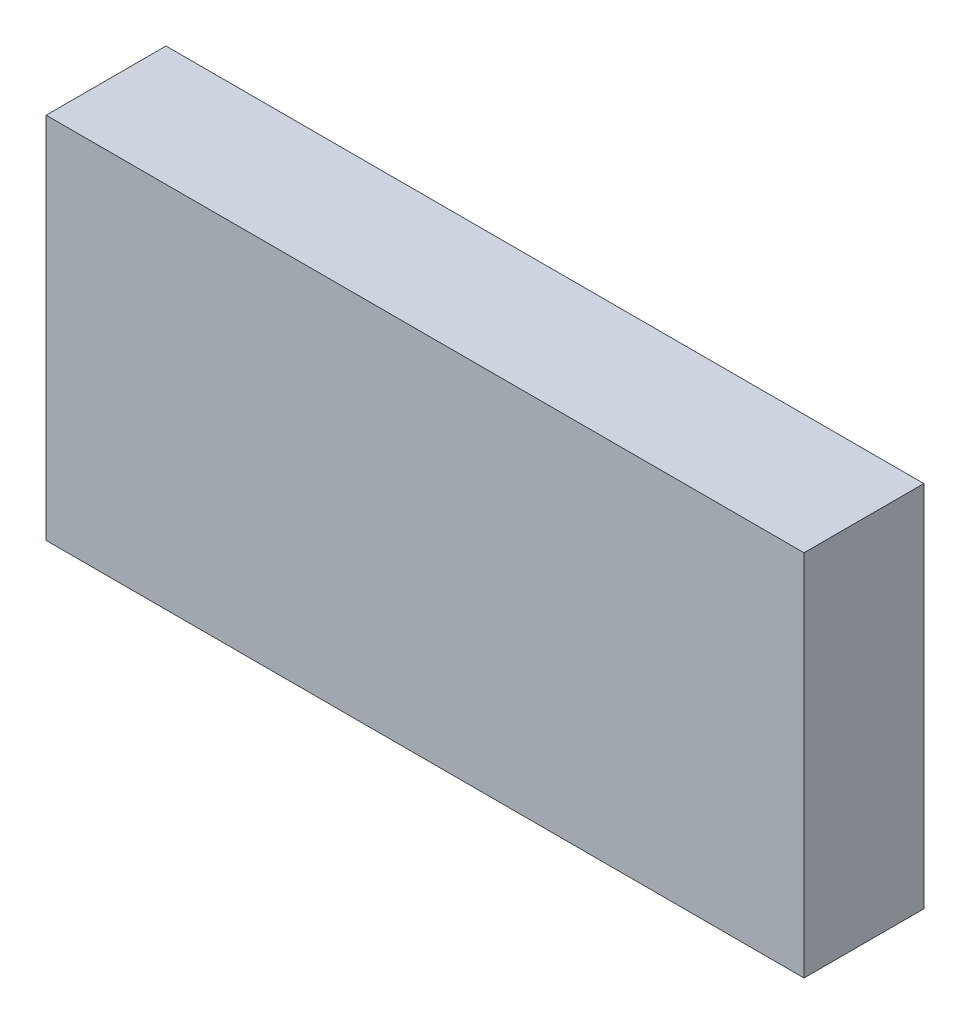
ISO-10303-21;
HEADER;
FILE_DESCRIPTION(('STEP AP214'),'2;1');
FILE_NAME('part.step','',(''),(''),'','','');
FILE_SCHEMA(('AUTOMOTIVE_DESIGN { 1 0 10303 214 1 1 1 1 }'));
ENDSEC;
DATA;
#1=APPLICATION_CONTEXT('core data for automotive mechanical design processes');
#2=APPLICATION_PROTOCOL_DEFINITION('international standard','automotive_design',2000,#1);
#3=PRODUCT_CONTEXT('',#1,'mechanical');
#4=PRODUCT('Part','Part','',(#3));
#5=PRODUCT_RELATED_PRODUCT_CATEGORY('part','',(#4));
#6=PRODUCT_DEFINITION_FORMATION('','',#4);
#7=PRODUCT_DEFINITION_CONTEXT('part definition',#1,'design');
#8=PRODUCT_DEFINITION('design','',#6,#7);
#9=PRODUCT_DEFINITION_SHAPE('','',#8);
#10=(LENGTH_UNIT() NAMED_UNIT(*) SI_UNIT(.MILLI.,.METRE.));
#11=(NAMED_UNIT(*) PLANE_ANGLE_UNIT() SI_UNIT($,.RADIAN.));
#12=(NAMED_UNIT(*) SI_UNIT($,.STERADIAN.) SOLID_ANGLE_UNIT());
#13=UNCERTAINTY_MEASURE_WITH_UNIT(LENGTH_MEASURE(1.E-05),#10,'distance_accuracy_value','');
#14=(GEOMETRIC_REPRESENTATION_CONTEXT(3) GLOBAL_UNCERTAINTY_ASSIGNED_CONTEXT((#13)) GLOBAL_UNIT_ASSIGNED_CONTEXT((#10,
#11,#12)) REPRESENTATION_CONTEXT('',''));
#15=CARTESIAN_POINT('',(0.,0.,0.));
#16=DIRECTION('',(0.,0.,1.));
#17=DIRECTION('',(1.,0.,0.));
#18=AXIS2_PLACEMENT_3D('',#15,#16,#17);
#19=CARTESIAN_POINT('',(-1.58115,0.76835,0.5));
#20=DIRECTION('',(0.,0.,1.));
#21=DIRECTION('',(1.,0.,0.));
#22=AXIS2_PLACEMENT_3D('',#19,#20,#21);
#23=PLANE('',#22);
#24=DIRECTION('',(0.,1.,0.));
#25=VECTOR('',#24,1.);
#26=CARTESIAN_POINT('',(1.58115,0.76835,0.5));
#27=LINE('',#26,#25);
#28=CARTESIAN_POINT('',(1.58115,0.76835,0.5));
#29=VERTEX_POINT('',#28);
#30=CARTESIAN_POINT('',(1.58115,-0.76835,0.5));
#31=VERTEX_POINT('',#30);
#32=EDGE_CURVE('E53',#29,#31,#27,.F.);
#33=ORIENTED_EDGE('',*,*,#32,.F.);
#34=DIRECTION('',(1.,0.,0.));
#35=VECTOR('',#34,1.);
#36=CARTESIAN_POINT('',(-1.58115,0.76835,0.5));
#37=LINE('',#36,#35);
#38=CARTESIAN_POINT('',(-1.58115,0.76835,0.5));
#39=VERTEX_POINT('',#38);
#40=EDGE_CURVE('E68',#39,#29,#37,.T.);
#41=ORIENTED_EDGE('',*,*,#40,.F.);
#42=DIRECTION('',(0.,1.,0.));
#43=VECTOR('',#42,1.);
#44=CARTESIAN_POINT('',(-1.58115,-0.76835,0.5));
#45=LINE('',#44,#43);
#46=CARTESIAN_POINT('',(-1.58115,-0.76835,0.5));
#47=VERTEX_POINT('',#46);
#48=EDGE_CURVE('E20',#47,#39,#45,.T.);
#49=ORIENTED_EDGE('',*,*,#48,.F.);
#50=DIRECTION('',(1.,0.,0.));
#51=VECTOR('',#50,1.);
#52=CARTESIAN_POINT('',(1.58115,-0.76835,0.5));
#53=LINE('',#52,#51);
#54=EDGE_CURVE('E58',#31,#47,#53,.F.);
#55=ORIENTED_EDGE('',*,*,#54,.F.);
#56=EDGE_LOOP('',(#33,#41,#49,#55));
#57=FACE_BOUND('',#56,.T.);
#58=ADVANCED_FACE('F17',(#57),#23,.T.);
#59=CARTESIAN_POINT('',(-1.58115,-0.76835,0.));
#60=DIRECTION('',(-1.,0.,0.));
#61=DIRECTION('',(0.,0.,1.));
#62=AXIS2_PLACEMENT_3D('',#59,#60,#61);
#63=PLANE('',#62);
#64=DIRECTION('',(0.,0.,1.));
#65=VECTOR('',#64,1.);
#66=CARTESIAN_POINT('',(-1.58115,0.76835,0.));
#67=LINE('',#66,#65);
#68=CARTESIAN_POINT('',(-1.58115,0.76835,0.));
#69=VERTEX_POINT('',#68);
#70=EDGE_CURVE('E79',#69,#39,#67,.T.);
#71=ORIENTED_EDGE('',*,*,#70,.F.);
#72=DIRECTION('',(0.,1.,0.));
#73=VECTOR('',#72,1.);
#74=CARTESIAN_POINT('',(-1.58115,0.76835,0.));
#75=LINE('',#74,#73);
#76=CARTESIAN_POINT('',(-1.58115,-0.76835,0.));
#77=VERTEX_POINT('',#76);
#78=EDGE_CURVE('E74',#69,#77,#75,.F.);
#79=ORIENTED_EDGE('',*,*,#78,.T.);
#80=DIRECTION('',(0.,0.,-1.));
#81=VECTOR('',#80,1.);
#82=CARTESIAN_POINT('',(-1.58115,-0.76835,0.));
#83=LINE('',#82,#81);
#84=EDGE_CURVE('E63',#47,#77,#83,.T.);
#85=ORIENTED_EDGE('',*,*,#84,.F.);
#86=ORIENTED_EDGE('',*,*,#48,.T.);
#87=EDGE_LOOP('',(#71,#79,#85,#86));
#88=FACE_BOUND('',#87,.T.);
#89=ADVANCED_FACE('F73',(#88),#63,.T.);
#90=CARTESIAN_POINT('',(1.58115,-0.76835,0.));
#91=DIRECTION('',(0.,-1.,0.));
#92=DIRECTION('',(0.,0.,-1.));
#93=AXIS2_PLACEMENT_3D('',#90,#91,#92);
#94=PLANE('',#93);
#95=ORIENTED_EDGE('',*,*,#84,.T.);
#96=DIRECTION('',(1.,0.,0.));
#97=VECTOR('',#96,1.);
#98=CARTESIAN_POINT('',(-1.58115,-0.76835,0.));
#99=LINE('',#98,#97);
#100=CARTESIAN_POINT('',(1.58115,-0.76835,0.));
#101=VERTEX_POINT('',#100);
#102=EDGE_CURVE('E84',#77,#101,#99,.T.);
#103=ORIENTED_EDGE('',*,*,#102,.T.);
#104=DIRECTION('',(0.,0.,-1.));
#105=VECTOR('',#104,1.);
#106=CARTESIAN_POINT('',(1.58115,-0.76835,0.));
#107=LINE('',#106,#105);
#108=EDGE_CURVE('E65',#31,#101,#107,.T.);
#109=ORIENTED_EDGE('',*,*,#108,.F.);
#110=ORIENTED_EDGE('',*,*,#54,.T.);
#111=EDGE_LOOP('',(#95,#103,#109,#110));
#112=FACE_BOUND('',#111,.T.);
#113=ADVANCED_FACE('F60',(#112),#94,.T.);
#114=CARTESIAN_POINT('',(1.58115,0.76835,0.));
#115=DIRECTION('',(1.,0.,0.));
#116=DIRECTION('',(0.,0.,-1.));
#117=AXIS2_PLACEMENT_3D('',#114,#115,#116);
#118=PLANE('',#117);
#119=ORIENTED_EDGE('',*,*,#108,.T.);
#120=DIRECTION('',(0.,1.,0.));
#121=VECTOR('',#120,1.);
#122=CARTESIAN_POINT('',(1.58115,0.76835,0.));
#123=LINE('',#122,#121);
#124=CARTESIAN_POINT('',(1.58115,0.76835,0.));
#125=VERTEX_POINT('',#124);
#126=EDGE_CURVE('E26',#101,#125,#123,.T.);
#127=ORIENTED_EDGE('',*,*,#126,.T.);
#128=DIRECTION('',(0.,0.,1.));
#129=VECTOR('',#128,1.);
#130=CARTESIAN_POINT('',(1.58115,0.76835,0.));
#131=LINE('',#130,#129);
#132=EDGE_CURVE('E34',#29,#125,#131,.F.);
#133=ORIENTED_EDGE('',*,*,#132,.F.);
#134=ORIENTED_EDGE('',*,*,#32,.T.);
#135=EDGE_LOOP('',(#119,#127,#133,#134));
#136=FACE_BOUND('',#135,.T.);
#137=ADVANCED_FACE('F88',(#136),#118,.T.);
#138=CARTESIAN_POINT('',(-1.58115,0.76835,0.));
#139=DIRECTION('',(0.,1.,0.));
#140=DIRECTION('',(0.,0.,1.));
#141=AXIS2_PLACEMENT_3D('',#138,#139,#140);
#142=PLANE('',#141);
#143=ORIENTED_EDGE('',*,*,#132,.T.);
#144=DIRECTION('',(1.,0.,0.));
#145=VECTOR('',#144,1.);
#146=CARTESIAN_POINT('',(-1.58115,0.76835,0.));
#147=LINE('',#146,#145);
#148=EDGE_CURVE('E11',#125,#69,#147,.F.);
#149=ORIENTED_EDGE('',*,*,#148,.T.);
#150=ORIENTED_EDGE('',*,*,#70,.T.);
#151=ORIENTED_EDGE('',*,*,#40,.T.);
#152=EDGE_LOOP('',(#143,#149,#150,#151));
#153=FACE_BOUND('',#152,.T.);
#154=ADVANCED_FACE('F91',(#153),#142,.T.);
#155=CARTESIAN_POINT('',(-1.58115,0.76835,0.));
#156=DIRECTION('',(0.,0.,1.));
#157=DIRECTION('',(1.,0.,0.));
#158=AXIS2_PLACEMENT_3D('',#155,#156,#157);
#159=PLANE('',#158);
#160=ORIENTED_EDGE('',*,*,#126,.F.);
#161=ORIENTED_EDGE('',*,*,#102,.F.);
#162=ORIENTED_EDGE('',*,*,#78,.F.);
#163=ORIENTED_EDGE('',*,*,#148,.F.);
#164=EDGE_LOOP('',(#160,#161,#162,#163));
#165=FACE_BOUND('',#164,.T.);
#166=ADVANCED_FACE('F90',(#165),#159,.F.);
#167=CLOSED_SHELL('',(#58,#89,#113,#137,#154,#166));
#168=MANIFOLD_SOLID_BREP('B1',#167);
#169=ADVANCED_BREP_SHAPE_REPRESENTATION('',(#18,#168),#14);
#170=SHAPE_DEFINITION_REPRESENTATION(#9,#169);
ENDSEC;
END-ISO-10303-21;
